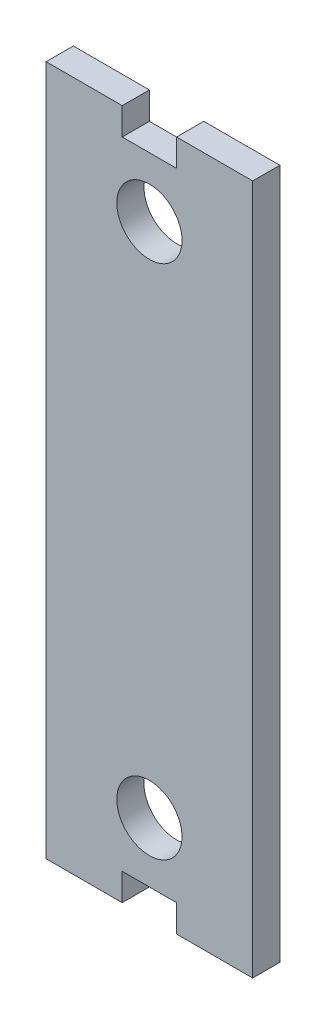
ISO-10303-21;
HEADER;
FILE_DESCRIPTION(('STEP AP214'),'2;1');
FILE_NAME('part.step','',(''),(''),'','','');
FILE_SCHEMA(('AUTOMOTIVE_DESIGN { 1 0 10303 214 1 1 1 1 }'));
ENDSEC;
DATA;
#1=APPLICATION_CONTEXT('core data for automotive mechanical design processes');
#2=APPLICATION_PROTOCOL_DEFINITION('international standard','automotive_design',2000,#1);
#3=PRODUCT_CONTEXT('',#1,'mechanical');
#4=PRODUCT('Part','Part','',(#3));
#5=PRODUCT_RELATED_PRODUCT_CATEGORY('part','',(#4));
#6=PRODUCT_DEFINITION_FORMATION('','',#4);
#7=PRODUCT_DEFINITION_CONTEXT('part definition',#1,'design');
#8=PRODUCT_DEFINITION('design','',#6,#7);
#9=PRODUCT_DEFINITION_SHAPE('','',#8);
#10=(LENGTH_UNIT() NAMED_UNIT(*) SI_UNIT(.MILLI.,.METRE.));
#11=(NAMED_UNIT(*) PLANE_ANGLE_UNIT() SI_UNIT($,.RADIAN.));
#12=(NAMED_UNIT(*) SI_UNIT($,.STERADIAN.) SOLID_ANGLE_UNIT());
#13=UNCERTAINTY_MEASURE_WITH_UNIT(LENGTH_MEASURE(1.E-05),#10,'distance_accuracy_value','');
#14=(GEOMETRIC_REPRESENTATION_CONTEXT(3) GLOBAL_UNCERTAINTY_ASSIGNED_CONTEXT((#13)) GLOBAL_UNIT_ASSIGNED_CONTEXT((#10,
#11,#12)) REPRESENTATION_CONTEXT('',''));
#15=CARTESIAN_POINT('',(0.,0.,0.));
#16=DIRECTION('',(0.,0.,1.));
#17=DIRECTION('',(1.,0.,0.));
#18=AXIS2_PLACEMENT_3D('',#15,#16,#17);
#19=CARTESIAN_POINT('',(0.,0.,5.));
#20=DIRECTION('',(0.,0.,1.));
#21=DIRECTION('',(1.,0.,0.));
#22=AXIS2_PLACEMENT_3D('',#19,#20,#21);
#23=PLANE('',#22);
#24=CARTESIAN_POINT('',(0.,47.5,5.));
#25=DIRECTION('',(0.,0.,1.));
#26=DIRECTION('',(1.,0.,0.));
#27=AXIS2_PLACEMENT_3D('',#24,#25,#26);
#28=CIRCLE('',#27,6.);
#29=CARTESIAN_POINT('',(6.,47.5,5.));
#30=VERTEX_POINT('',#29);
#31=EDGE_CURVE('E164',#30,#30,#28,.T.);
#32=ORIENTED_EDGE('',*,*,#31,.F.);
#33=EDGE_LOOP('',(#32));
#34=FACE_BOUND('',#33,.T.);
#35=DIRECTION('',(0.,-1.,0.));
#36=VECTOR('',#35,1.);
#37=CARTESIAN_POINT('',(5.,58.5000000000003,5.));
#38=LINE('',#37,#36);
#39=CARTESIAN_POINT('',(5.,63.5000000000003,5.));
#40=VERTEX_POINT('',#39);
#41=CARTESIAN_POINT('',(5.,58.5000000000003,5.));
#42=VERTEX_POINT('',#41);
#43=EDGE_CURVE('E183',#40,#42,#38,.T.);
#44=ORIENTED_EDGE('',*,*,#43,.T.);
#45=DIRECTION('',(-1.,0.,0.));
#46=VECTOR('',#45,1.);
#47=CARTESIAN_POINT('',(-5.,58.5000000000003,5.));
#48=LINE('',#47,#46);
#49=CARTESIAN_POINT('',(-5.,58.5000000000003,5.));
#50=VERTEX_POINT('',#49);
#51=EDGE_CURVE('E111',#42,#50,#48,.T.);
#52=ORIENTED_EDGE('',*,*,#51,.T.);
#53=DIRECTION('',(0.,1.,0.));
#54=VECTOR('',#53,1.);
#55=CARTESIAN_POINT('',(-5.,63.5000000000003,5.));
#56=LINE('',#55,#54);
#57=CARTESIAN_POINT('',(-5.,63.5000000000003,5.));
#58=VERTEX_POINT('',#57);
#59=EDGE_CURVE('E210',#50,#58,#56,.T.);
#60=ORIENTED_EDGE('',*,*,#59,.T.);
#61=DIRECTION('',(-1.,0.,0.));
#62=VECTOR('',#61,1.);
#63=CARTESIAN_POINT('',(-5.,63.5000000000003,5.));
#64=LINE('',#63,#62);
#65=CARTESIAN_POINT('',(-19.0000000000001,63.5,5.));
#66=VERTEX_POINT('',#65);
#67=EDGE_CURVE('E229',#58,#66,#64,.T.);
#68=ORIENTED_EDGE('',*,*,#67,.T.);
#69=DIRECTION('',(0.,-1.,0.));
#70=VECTOR('',#69,1.);
#71=CARTESIAN_POINT('',(-19.0000000000001,63.5,5.));
#72=LINE('',#71,#70);
#73=CARTESIAN_POINT('',(-19.,-63.5,5.));
#74=VERTEX_POINT('',#73);
#75=EDGE_CURVE('E226',#66,#74,#72,.T.);
#76=ORIENTED_EDGE('',*,*,#75,.T.);
#77=DIRECTION('',(1.,0.,0.));
#78=VECTOR('',#77,1.);
#79=CARTESIAN_POINT('',(-19.,-63.5,5.));
#80=LINE('',#79,#78);
#81=CARTESIAN_POINT('',(-5.,-63.5000000000003,5.));
#82=VERTEX_POINT('',#81);
#83=EDGE_CURVE('E228',#74,#82,#80,.T.);
#84=ORIENTED_EDGE('',*,*,#83,.T.);
#85=DIRECTION('',(0.,1.,0.));
#86=VECTOR('',#85,1.);
#87=CARTESIAN_POINT('',(-5.,-63.5000000000003,5.));
#88=LINE('',#87,#86);
#89=CARTESIAN_POINT('',(-5.,-58.5000000000003,5.));
#90=VERTEX_POINT('',#89);
#91=EDGE_CURVE('E231',#82,#90,#88,.T.);
#92=ORIENTED_EDGE('',*,*,#91,.T.);
#93=DIRECTION('',(1.,0.,0.));
#94=VECTOR('',#93,1.);
#95=CARTESIAN_POINT('',(-5.,-58.5000000000003,5.));
#96=LINE('',#95,#94);
#97=CARTESIAN_POINT('',(5.,-58.5000000000003,5.));
#98=VERTEX_POINT('',#97);
#99=EDGE_CURVE('E237',#90,#98,#96,.T.);
#100=ORIENTED_EDGE('',*,*,#99,.T.);
#101=DIRECTION('',(0.,-1.,0.));
#102=VECTOR('',#101,1.);
#103=CARTESIAN_POINT('',(5.,-58.5000000000003,5.));
#104=LINE('',#103,#102);
#105=CARTESIAN_POINT('',(5.,-63.5000000000003,5.));
#106=VERTEX_POINT('',#105);
#107=EDGE_CURVE('E142',#98,#106,#104,.T.);
#108=ORIENTED_EDGE('',*,*,#107,.T.);
#109=DIRECTION('',(1.,0.,0.));
#110=VECTOR('',#109,1.);
#111=CARTESIAN_POINT('',(5.,-63.5000000000003,5.));
#112=LINE('',#111,#110);
#113=CARTESIAN_POINT('',(19.,-63.5,5.));
#114=VERTEX_POINT('',#113);
#115=EDGE_CURVE('E136',#106,#114,#112,.T.);
#116=ORIENTED_EDGE('',*,*,#115,.T.);
#117=DIRECTION('',(0.,1.,0.));
#118=VECTOR('',#117,1.);
#119=CARTESIAN_POINT('',(19.,-63.5,5.));
#120=LINE('',#119,#118);
#121=CARTESIAN_POINT('',(19.0000000000001,63.5,5.));
#122=VERTEX_POINT('',#121);
#123=EDGE_CURVE('E140',#114,#122,#120,.T.);
#124=ORIENTED_EDGE('',*,*,#123,.T.);
#125=DIRECTION('',(-1.,0.,0.));
#126=VECTOR('',#125,1.);
#127=CARTESIAN_POINT('',(19.0000000000001,63.5,5.));
#128=LINE('',#127,#126);
#129=EDGE_CURVE('E56',#122,#40,#128,.T.);
#130=ORIENTED_EDGE('',*,*,#129,.T.);
#131=EDGE_LOOP('',(#44,#52,#60,#68,#76,#84,#92,#100,#108,#116,#124,#130));
#132=FACE_BOUND('',#131,.T.);
#133=CARTESIAN_POINT('',(0.,-47.5,5.));
#134=DIRECTION('',(0.,0.,1.));
#135=DIRECTION('',(-1.,0.,0.));
#136=AXIS2_PLACEMENT_3D('',#133,#134,#135);
#137=CIRCLE('',#136,6.);
#138=CARTESIAN_POINT('',(-6.,-47.5,5.));
#139=VERTEX_POINT('',#138);
#140=EDGE_CURVE('E279',#139,#139,#137,.T.);
#141=ORIENTED_EDGE('',*,*,#140,.F.);
#142=EDGE_LOOP('',(#141));
#143=FACE_BOUND('',#142,.T.);
#144=ADVANCED_FACE('F39',(#34,#132,#143),#23,.T.);
#145=CARTESIAN_POINT('',(0.,0.,0.));
#146=DIRECTION('',(0.,0.,1.));
#147=DIRECTION('',(1.,0.,0.));
#148=AXIS2_PLACEMENT_3D('',#145,#146,#147);
#149=PLANE('',#148);
#150=DIRECTION('',(0.,-1.,0.));
#151=VECTOR('',#150,1.);
#152=CARTESIAN_POINT('',(5.,58.5000000000003,0.));
#153=LINE('',#152,#151);
#154=CARTESIAN_POINT('',(5.,63.5000000000003,0.));
#155=VERTEX_POINT('',#154);
#156=CARTESIAN_POINT('',(5.,58.5000000000003,0.));
#157=VERTEX_POINT('',#156);
#158=EDGE_CURVE('E160',#155,#157,#153,.T.);
#159=ORIENTED_EDGE('',*,*,#158,.F.);
#160=DIRECTION('',(-1.,0.,0.));
#161=VECTOR('',#160,1.);
#162=CARTESIAN_POINT('',(19.0000000000001,63.5,0.));
#163=LINE('',#162,#161);
#164=CARTESIAN_POINT('',(19.0000000000001,63.5,0.));
#165=VERTEX_POINT('',#164);
#166=EDGE_CURVE('E103',#165,#155,#163,.T.);
#167=ORIENTED_EDGE('',*,*,#166,.F.);
#168=DIRECTION('',(0.,1.,0.));
#169=VECTOR('',#168,1.);
#170=CARTESIAN_POINT('',(19.,-63.5,0.));
#171=LINE('',#170,#169);
#172=CARTESIAN_POINT('',(19.,-63.5,0.));
#173=VERTEX_POINT('',#172);
#174=EDGE_CURVE('E97',#173,#165,#171,.T.);
#175=ORIENTED_EDGE('',*,*,#174,.F.);
#176=DIRECTION('',(1.,0.,0.));
#177=VECTOR('',#176,1.);
#178=CARTESIAN_POINT('',(5.,-63.5000000000003,0.));
#179=LINE('',#178,#177);
#180=CARTESIAN_POINT('',(5.,-63.5000000000003,0.));
#181=VERTEX_POINT('',#180);
#182=EDGE_CURVE('E150',#181,#173,#179,.T.);
#183=ORIENTED_EDGE('',*,*,#182,.F.);
#184=DIRECTION('',(0.,-1.,0.));
#185=VECTOR('',#184,1.);
#186=CARTESIAN_POINT('',(5.,-58.5000000000003,0.));
#187=LINE('',#186,#185);
#188=CARTESIAN_POINT('',(5.,-58.5000000000003,0.));
#189=VERTEX_POINT('',#188);
#190=EDGE_CURVE('E178',#189,#181,#187,.T.);
#191=ORIENTED_EDGE('',*,*,#190,.F.);
#192=DIRECTION('',(1.,0.,0.));
#193=VECTOR('',#192,1.);
#194=CARTESIAN_POINT('',(-5.,-58.5000000000003,0.));
#195=LINE('',#194,#193);
#196=CARTESIAN_POINT('',(-5.,-58.5000000000003,0.));
#197=VERTEX_POINT('',#196);
#198=EDGE_CURVE('E176',#197,#189,#195,.T.);
#199=ORIENTED_EDGE('',*,*,#198,.F.);
#200=DIRECTION('',(0.,1.,0.));
#201=VECTOR('',#200,1.);
#202=CARTESIAN_POINT('',(-5.,-63.5000000000003,0.));
#203=LINE('',#202,#201);
#204=CARTESIAN_POINT('',(-5.,-63.5000000000003,0.));
#205=VERTEX_POINT('',#204);
#206=EDGE_CURVE('E174',#205,#197,#203,.T.);
#207=ORIENTED_EDGE('',*,*,#206,.F.);
#208=DIRECTION('',(1.,0.,0.));
#209=VECTOR('',#208,1.);
#210=CARTESIAN_POINT('',(-19.,-63.5,0.));
#211=LINE('',#210,#209);
#212=CARTESIAN_POINT('',(-19.,-63.5,0.));
#213=VERTEX_POINT('',#212);
#214=EDGE_CURVE('E172',#213,#205,#211,.T.);
#215=ORIENTED_EDGE('',*,*,#214,.F.);
#216=DIRECTION('',(0.,-1.,0.));
#217=VECTOR('',#216,1.);
#218=CARTESIAN_POINT('',(-19.0000000000001,63.5,0.));
#219=LINE('',#218,#217);
#220=CARTESIAN_POINT('',(-19.0000000000001,63.5,0.));
#221=VERTEX_POINT('',#220);
#222=EDGE_CURVE('E170',#221,#213,#219,.T.);
#223=ORIENTED_EDGE('',*,*,#222,.F.);
#224=DIRECTION('',(-1.,0.,0.));
#225=VECTOR('',#224,1.);
#226=CARTESIAN_POINT('',(-5.,63.5000000000003,0.));
#227=LINE('',#226,#225);
#228=CARTESIAN_POINT('',(-5.,63.5000000000003,0.));
#229=VERTEX_POINT('',#228);
#230=EDGE_CURVE('E168',#229,#221,#227,.T.);
#231=ORIENTED_EDGE('',*,*,#230,.F.);
#232=DIRECTION('',(0.,1.,0.));
#233=VECTOR('',#232,1.);
#234=CARTESIAN_POINT('',(-5.,63.5000000000003,0.));
#235=LINE('',#234,#233);
#236=CARTESIAN_POINT('',(-5.,58.5000000000003,0.));
#237=VERTEX_POINT('',#236);
#238=EDGE_CURVE('E166',#237,#229,#235,.T.);
#239=ORIENTED_EDGE('',*,*,#238,.F.);
#240=DIRECTION('',(-1.,0.,0.));
#241=VECTOR('',#240,1.);
#242=CARTESIAN_POINT('',(-5.,58.5000000000003,0.));
#243=LINE('',#242,#241);
#244=EDGE_CURVE('E163',#157,#237,#243,.T.);
#245=ORIENTED_EDGE('',*,*,#244,.F.);
#246=EDGE_LOOP('',(#159,#167,#175,#183,#191,#199,#207,#215,#223,#231,#239,#245));
#247=FACE_BOUND('',#246,.T.);
#248=CARTESIAN_POINT('',(0.,47.5,0.));
#249=DIRECTION('',(0.,0.,1.));
#250=DIRECTION('',(1.,0.,0.));
#251=AXIS2_PLACEMENT_3D('',#248,#249,#250);
#252=CIRCLE('',#251,6.);
#253=CARTESIAN_POINT('',(6.,47.5,0.));
#254=VERTEX_POINT('',#253);
#255=EDGE_CURVE('E285',#254,#254,#252,.T.);
#256=ORIENTED_EDGE('',*,*,#255,.T.);
#257=EDGE_LOOP('',(#256));
#258=FACE_BOUND('',#257,.T.);
#259=CARTESIAN_POINT('',(0.,-47.5,0.));
#260=DIRECTION('',(0.,0.,1.));
#261=DIRECTION('',(-1.,0.,0.));
#262=AXIS2_PLACEMENT_3D('',#259,#260,#261);
#263=CIRCLE('',#262,6.);
#264=CARTESIAN_POINT('',(-6.,-47.5,0.));
#265=VERTEX_POINT('',#264);
#266=EDGE_CURVE('E282',#265,#265,#263,.T.);
#267=ORIENTED_EDGE('',*,*,#266,.T.);
#268=EDGE_LOOP('',(#267));
#269=FACE_BOUND('',#268,.T.);
#270=ADVANCED_FACE('F214',(#247,#258,#269),#149,.F.);
#271=CARTESIAN_POINT('',(5.,58.5000000000003,5.));
#272=DIRECTION('',(1.,0.,0.));
#273=DIRECTION('',(0.,0.,-1.));
#274=AXIS2_PLACEMENT_3D('',#271,#272,#273);
#275=PLANE('',#274);
#276=ORIENTED_EDGE('',*,*,#158,.T.);
#277=DIRECTION('',(0.,0.,-1.));
#278=VECTOR('',#277,1.);
#279=CARTESIAN_POINT('',(5.,58.5000000000003,5.));
#280=LINE('',#279,#278);
#281=EDGE_CURVE('E11',#42,#157,#280,.T.);
#282=ORIENTED_EDGE('',*,*,#281,.F.);
#283=ORIENTED_EDGE('',*,*,#43,.F.);
#284=DIRECTION('',(0.,0.,-1.));
#285=VECTOR('',#284,1.);
#286=CARTESIAN_POINT('',(5.,63.5000000000003,5.));
#287=LINE('',#286,#285);
#288=EDGE_CURVE('E156',#40,#155,#287,.T.);
#289=ORIENTED_EDGE('',*,*,#288,.T.);
#290=EDGE_LOOP('',(#276,#282,#283,#289));
#291=FACE_BOUND('',#290,.T.);
#292=ADVANCED_FACE('F41',(#291),#275,.F.);
#293=CARTESIAN_POINT('',(-5.,58.5000000000003,5.));
#294=DIRECTION('',(0.,-1.,0.));
#295=DIRECTION('',(0.,0.,-1.));
#296=AXIS2_PLACEMENT_3D('',#293,#294,#295);
#297=PLANE('',#296);
#298=ORIENTED_EDGE('',*,*,#244,.T.);
#299=DIRECTION('',(0.,0.,-1.));
#300=VECTOR('',#299,1.);
#301=CARTESIAN_POINT('',(-5.,58.5000000000003,5.));
#302=LINE('',#301,#300);
#303=EDGE_CURVE('E48',#50,#237,#302,.T.);
#304=ORIENTED_EDGE('',*,*,#303,.F.);
#305=ORIENTED_EDGE('',*,*,#51,.F.);
#306=ORIENTED_EDGE('',*,*,#281,.T.);
#307=EDGE_LOOP('',(#298,#304,#305,#306));
#308=FACE_BOUND('',#307,.T.);
#309=ADVANCED_FACE('F380',(#308),#297,.F.);
#310=CARTESIAN_POINT('',(-5.,63.5000000000003,5.));
#311=DIRECTION('',(-1.,0.,0.));
#312=DIRECTION('',(0.,0.,1.));
#313=AXIS2_PLACEMENT_3D('',#310,#311,#312);
#314=PLANE('',#313);
#315=ORIENTED_EDGE('',*,*,#238,.T.);
#316=DIRECTION('',(0.,0.,-1.));
#317=VECTOR('',#316,1.);
#318=CARTESIAN_POINT('',(-5.,63.5000000000003,5.));
#319=LINE('',#318,#317);
#320=EDGE_CURVE('E202',#58,#229,#319,.T.);
#321=ORIENTED_EDGE('',*,*,#320,.F.);
#322=ORIENTED_EDGE('',*,*,#59,.F.);
#323=ORIENTED_EDGE('',*,*,#303,.T.);
#324=EDGE_LOOP('',(#315,#321,#322,#323));
#325=FACE_BOUND('',#324,.T.);
#326=ADVANCED_FACE('F208',(#325),#314,.F.);
#327=CARTESIAN_POINT('',(-5.,63.5000000000003,5.));
#328=DIRECTION('',(0.,-1.,0.));
#329=DIRECTION('',(1.,0.,0.));
#330=AXIS2_PLACEMENT_3D('',#327,#328,#329);
#331=PLANE('',#330);
#332=ORIENTED_EDGE('',*,*,#230,.T.);
#333=DIRECTION('',(0.,0.,-1.));
#334=VECTOR('',#333,1.);
#335=CARTESIAN_POINT('',(-19.0000000000001,63.5,5.));
#336=LINE('',#335,#334);
#337=EDGE_CURVE('E199',#66,#221,#336,.T.);
#338=ORIENTED_EDGE('',*,*,#337,.F.);
#339=ORIENTED_EDGE('',*,*,#67,.F.);
#340=ORIENTED_EDGE('',*,*,#320,.T.);
#341=EDGE_LOOP('',(#332,#338,#339,#340));
#342=FACE_BOUND('',#341,.T.);
#343=ADVANCED_FACE('F220',(#342),#331,.F.);
#344=CARTESIAN_POINT('',(-19.0000000000001,63.5,5.));
#345=DIRECTION('',(1.,0.,0.));
#346=DIRECTION('',(0.,1.,0.));
#347=AXIS2_PLACEMENT_3D('',#344,#345,#346);
#348=PLANE('',#347);
#349=ORIENTED_EDGE('',*,*,#222,.T.);
#350=DIRECTION('',(0.,0.,-1.));
#351=VECTOR('',#350,1.);
#352=CARTESIAN_POINT('',(-19.,-63.5,5.));
#353=LINE('',#352,#351);
#354=EDGE_CURVE('E196',#74,#213,#353,.T.);
#355=ORIENTED_EDGE('',*,*,#354,.F.);
#356=ORIENTED_EDGE('',*,*,#75,.F.);
#357=ORIENTED_EDGE('',*,*,#337,.T.);
#358=EDGE_LOOP('',(#349,#355,#356,#357));
#359=FACE_BOUND('',#358,.T.);
#360=ADVANCED_FACE('F224',(#359),#348,.F.);
#361=CARTESIAN_POINT('',(-19.,-63.5,5.));
#362=DIRECTION('',(0.,1.,0.));
#363=DIRECTION('',(-1.,0.,0.));
#364=AXIS2_PLACEMENT_3D('',#361,#362,#363);
#365=PLANE('',#364);
#366=ORIENTED_EDGE('',*,*,#214,.T.);
#367=DIRECTION('',(0.,0.,-1.));
#368=VECTOR('',#367,1.);
#369=CARTESIAN_POINT('',(-5.,-63.5000000000003,5.));
#370=LINE('',#369,#368);
#371=EDGE_CURVE('E193',#82,#205,#370,.T.);
#372=ORIENTED_EDGE('',*,*,#371,.F.);
#373=ORIENTED_EDGE('',*,*,#83,.F.);
#374=ORIENTED_EDGE('',*,*,#354,.T.);
#375=EDGE_LOOP('',(#366,#372,#373,#374));
#376=FACE_BOUND('',#375,.T.);
#377=ADVANCED_FACE('F345',(#376),#365,.F.);
#378=CARTESIAN_POINT('',(-5.,-63.5000000000003,5.));
#379=DIRECTION('',(-1.,0.,0.));
#380=DIRECTION('',(0.,0.,1.));
#381=AXIS2_PLACEMENT_3D('',#378,#379,#380);
#382=PLANE('',#381);
#383=ORIENTED_EDGE('',*,*,#206,.T.);
#384=DIRECTION('',(0.,0.,-1.));
#385=VECTOR('',#384,1.);
#386=CARTESIAN_POINT('',(-5.,-58.5000000000003,5.));
#387=LINE('',#386,#385);
#388=EDGE_CURVE('E190',#90,#197,#387,.T.);
#389=ORIENTED_EDGE('',*,*,#388,.F.);
#390=ORIENTED_EDGE('',*,*,#91,.F.);
#391=ORIENTED_EDGE('',*,*,#371,.T.);
#392=EDGE_LOOP('',(#383,#389,#390,#391));
#393=FACE_BOUND('',#392,.T.);
#394=ADVANCED_FACE('F336',(#393),#382,.F.);
#395=CARTESIAN_POINT('',(-5.,-58.5000000000003,5.));
#396=DIRECTION('',(0.,1.,0.));
#397=DIRECTION('',(0.,0.,1.));
#398=AXIS2_PLACEMENT_3D('',#395,#396,#397);
#399=PLANE('',#398);
#400=ORIENTED_EDGE('',*,*,#198,.T.);
#401=DIRECTION('',(0.,0.,-1.));
#402=VECTOR('',#401,1.);
#403=CARTESIAN_POINT('',(5.,-58.5000000000003,5.));
#404=LINE('',#403,#402);
#405=EDGE_CURVE('E187',#98,#189,#404,.T.);
#406=ORIENTED_EDGE('',*,*,#405,.F.);
#407=ORIENTED_EDGE('',*,*,#99,.F.);
#408=ORIENTED_EDGE('',*,*,#388,.T.);
#409=EDGE_LOOP('',(#400,#406,#407,#408));
#410=FACE_BOUND('',#409,.T.);
#411=ADVANCED_FACE('F243',(#410),#399,.F.);
#412=CARTESIAN_POINT('',(5.,-58.5000000000003,5.));
#413=DIRECTION('',(1.,0.,0.));
#414=DIRECTION('',(0.,0.,-1.));
#415=AXIS2_PLACEMENT_3D('',#412,#413,#414);
#416=PLANE('',#415);
#417=ORIENTED_EDGE('',*,*,#190,.T.);
#418=DIRECTION('',(0.,0.,-1.));
#419=VECTOR('',#418,1.);
#420=CARTESIAN_POINT('',(5.,-63.5000000000003,5.));
#421=LINE('',#420,#419);
#422=EDGE_CURVE('E151',#106,#181,#421,.T.);
#423=ORIENTED_EDGE('',*,*,#422,.F.);
#424=ORIENTED_EDGE('',*,*,#107,.F.);
#425=ORIENTED_EDGE('',*,*,#405,.T.);
#426=EDGE_LOOP('',(#417,#423,#424,#425));
#427=FACE_BOUND('',#426,.T.);
#428=ADVANCED_FACE('F247',(#427),#416,.F.);
#429=CARTESIAN_POINT('',(5.,-63.5000000000003,5.));
#430=DIRECTION('',(0.,1.,0.));
#431=DIRECTION('',(-1.,0.,0.));
#432=AXIS2_PLACEMENT_3D('',#429,#430,#431);
#433=PLANE('',#432);
#434=ORIENTED_EDGE('',*,*,#182,.T.);
#435=DIRECTION('',(0.,0.,-1.));
#436=VECTOR('',#435,1.);
#437=CARTESIAN_POINT('',(19.,-63.5,5.));
#438=LINE('',#437,#436);
#439=EDGE_CURVE('E147',#114,#173,#438,.T.);
#440=ORIENTED_EDGE('',*,*,#439,.F.);
#441=ORIENTED_EDGE('',*,*,#115,.F.);
#442=ORIENTED_EDGE('',*,*,#422,.T.);
#443=EDGE_LOOP('',(#434,#440,#441,#442));
#444=FACE_BOUND('',#443,.T.);
#445=ADVANCED_FACE('F148',(#444),#433,.F.);
#446=CARTESIAN_POINT('',(19.,-63.5,5.));
#447=DIRECTION('',(-1.,0.,0.));
#448=DIRECTION('',(0.,-1.,0.));
#449=AXIS2_PLACEMENT_3D('',#446,#447,#448);
#450=PLANE('',#449);
#451=ORIENTED_EDGE('',*,*,#174,.T.);
#452=DIRECTION('',(0.,0.,-1.));
#453=VECTOR('',#452,1.);
#454=CARTESIAN_POINT('',(19.0000000000001,63.5,5.));
#455=LINE('',#454,#453);
#456=EDGE_CURVE('E152',#122,#165,#455,.T.);
#457=ORIENTED_EDGE('',*,*,#456,.F.);
#458=ORIENTED_EDGE('',*,*,#123,.F.);
#459=ORIENTED_EDGE('',*,*,#439,.T.);
#460=EDGE_LOOP('',(#451,#457,#458,#459));
#461=FACE_BOUND('',#460,.T.);
#462=ADVANCED_FACE('F154',(#461),#450,.F.);
#463=CARTESIAN_POINT('',(19.0000000000001,63.5,5.));
#464=DIRECTION('',(0.,-1.,0.));
#465=DIRECTION('',(1.,0.,0.));
#466=AXIS2_PLACEMENT_3D('',#463,#464,#465);
#467=PLANE('',#466);
#468=ORIENTED_EDGE('',*,*,#166,.T.);
#469=ORIENTED_EDGE('',*,*,#288,.F.);
#470=ORIENTED_EDGE('',*,*,#129,.F.);
#471=ORIENTED_EDGE('',*,*,#456,.T.);
#472=EDGE_LOOP('',(#468,#469,#470,#471));
#473=FACE_BOUND('',#472,.T.);
#474=ADVANCED_FACE('F251',(#473),#467,.F.);
#475=CARTESIAN_POINT('',(0.,47.5,5.));
#476=DIRECTION('',(0.,0.,-1.));
#477=DIRECTION('',(-1.,0.,0.));
#478=AXIS2_PLACEMENT_3D('',#475,#476,#477);
#479=CYLINDRICAL_SURFACE('',#478,6.);
#480=ORIENTED_EDGE('',*,*,#31,.T.);
#481=EDGE_LOOP('',(#480));
#482=FACE_BOUND('',#481,.T.);
#483=ORIENTED_EDGE('',*,*,#255,.F.);
#484=EDGE_LOOP('',(#483));
#485=FACE_BOUND('',#484,.T.);
#486=ADVANCED_FACE('F253',(#482,#485),#479,.F.);
#487=CARTESIAN_POINT('',(0.,-47.5,5.));
#488=DIRECTION('',(0.,0.,-1.));
#489=DIRECTION('',(-1.,0.,0.));
#490=AXIS2_PLACEMENT_3D('',#487,#488,#489);
#491=CYLINDRICAL_SURFACE('',#490,6.);
#492=ORIENTED_EDGE('',*,*,#140,.T.);
#493=EDGE_LOOP('',(#492));
#494=FACE_BOUND('',#493,.T.);
#495=ORIENTED_EDGE('',*,*,#266,.F.);
#496=EDGE_LOOP('',(#495));
#497=FACE_BOUND('',#496,.T.);
#498=ADVANCED_FACE('F259',(#494,#497),#491,.F.);
#499=CLOSED_SHELL('',(#144,#270,#292,#309,#326,#343,#360,#377,#394,#411,#428,#445,#462,#474,
#486,#498));
#500=MANIFOLD_SOLID_BREP('B2',#499);
#501=ADVANCED_BREP_SHAPE_REPRESENTATION('',(#18,#500),#14);
#502=SHAPE_DEFINITION_REPRESENTATION(#9,#501);
ENDSEC;
END-ISO-10303-21;
